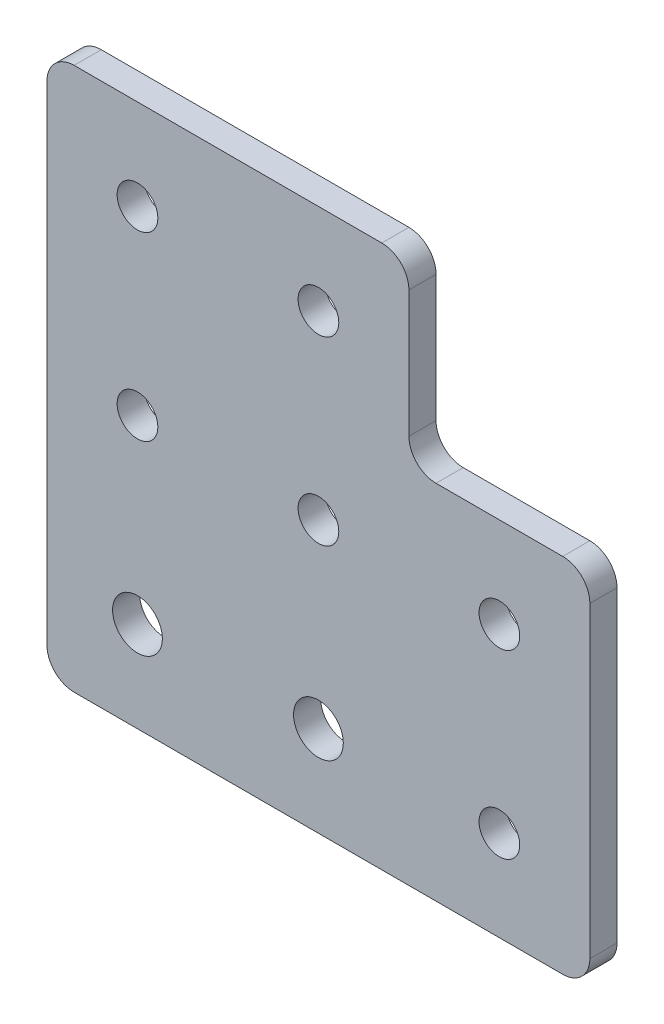
ISO-10303-21;
HEADER;
FILE_DESCRIPTION(('STEP AP214'),'2;1');
FILE_NAME('part.step','',(''),(''),'','','');
FILE_SCHEMA(('AUTOMOTIVE_DESIGN { 1 0 10303 214 1 1 1 1 }'));
ENDSEC;
DATA;
#1=APPLICATION_CONTEXT('core data for automotive mechanical design processes');
#2=APPLICATION_PROTOCOL_DEFINITION('international standard','automotive_design',2000,#1);
#3=PRODUCT_CONTEXT('',#1,'mechanical');
#4=PRODUCT('Part','Part','',(#3));
#5=PRODUCT_RELATED_PRODUCT_CATEGORY('part','',(#4));
#6=PRODUCT_DEFINITION_FORMATION('','',#4);
#7=PRODUCT_DEFINITION_CONTEXT('part definition',#1,'design');
#8=PRODUCT_DEFINITION('design','',#6,#7);
#9=PRODUCT_DEFINITION_SHAPE('','',#8);
#10=(LENGTH_UNIT() NAMED_UNIT(*) SI_UNIT(.MILLI.,.METRE.));
#11=(NAMED_UNIT(*) PLANE_ANGLE_UNIT() SI_UNIT($,.RADIAN.));
#12=(NAMED_UNIT(*) SI_UNIT($,.STERADIAN.) SOLID_ANGLE_UNIT());
#13=UNCERTAINTY_MEASURE_WITH_UNIT(LENGTH_MEASURE(1.E-05),#10,'distance_accuracy_value','');
#14=(GEOMETRIC_REPRESENTATION_CONTEXT(3) GLOBAL_UNCERTAINTY_ASSIGNED_CONTEXT((#13)) GLOBAL_UNIT_ASSIGNED_CONTEXT((#10,
#11,#12)) REPRESENTATION_CONTEXT('',''));
#15=CARTESIAN_POINT('',(0.,0.,0.));
#16=DIRECTION('',(0.,0.,1.));
#17=DIRECTION('',(1.,0.,0.));
#18=AXIS2_PLACEMENT_3D('',#15,#16,#17);
#19=CARTESIAN_POINT('',(0.,-9.61116559346406,3.));
#20=DIRECTION('',(0.,1.,0.));
#21=DIRECTION('',(0.,0.,1.));
#22=AXIS2_PLACEMENT_3D('',#19,#20,#21);
#23=PLANE('',#22);
#24=DIRECTION('',(1.,0.,0.));
#25=VECTOR('',#24,1.);
#26=CARTESIAN_POINT('',(0.,-9.61116559346406,0.));
#27=LINE('',#26,#25);
#28=CARTESIAN_POINT('',(-28.6285979916155,-9.61116559346406,0.));
#29=VERTEX_POINT('',#28);
#30=CARTESIAN_POINT('',(25.3714020083845,-9.61116559346406,0.));
#31=VERTEX_POINT('',#30);
#32=EDGE_CURVE('E146',#29,#31,#27,.T.);
#33=ORIENTED_EDGE('',*,*,#32,.T.);
#34=DIRECTION('',(0.,0.,-1.));
#35=VECTOR('',#34,1.);
#36=CARTESIAN_POINT('',(25.3714020083845,-9.61116559346406,3.));
#37=LINE('',#36,#35);
#38=CARTESIAN_POINT('',(25.3714020083845,-9.61116559346406,3.));
#39=VERTEX_POINT('',#38);
#40=EDGE_CURVE('E125',#31,#39,#37,.F.);
#41=ORIENTED_EDGE('',*,*,#40,.T.);
#42=DIRECTION('',(1.,0.,0.));
#43=VECTOR('',#42,1.);
#44=CARTESIAN_POINT('',(0.,-9.61116559346406,3.));
#45=LINE('',#44,#43);
#46=CARTESIAN_POINT('',(-28.6285979916155,-9.61116559346406,3.));
#47=VERTEX_POINT('',#46);
#48=EDGE_CURVE('E327',#47,#39,#45,.T.);
#49=ORIENTED_EDGE('',*,*,#48,.F.);
#50=DIRECTION('',(0.,0.,-1.));
#51=VECTOR('',#50,1.);
#52=CARTESIAN_POINT('',(-28.6285979916155,-9.61116559346406,3.));
#53=LINE('',#52,#51);
#54=EDGE_CURVE('E129',#47,#29,#53,.T.);
#55=ORIENTED_EDGE('',*,*,#54,.T.);
#56=EDGE_LOOP('',(#33,#41,#49,#55));
#57=FACE_BOUND('',#56,.T.);
#58=ADVANCED_FACE('F33',(#57),#23,.F.);
#59=CARTESIAN_POINT('',(28.3714020083845,0.,3.));
#60=DIRECTION('',(-1.,0.,0.));
#61=DIRECTION('',(0.,0.,1.));
#62=AXIS2_PLACEMENT_3D('',#59,#60,#61);
#63=PLANE('',#62);
#64=DIRECTION('',(0.,1.,0.));
#65=VECTOR('',#64,1.);
#66=CARTESIAN_POINT('',(28.3714020083845,0.,3.));
#67=LINE('',#66,#65);
#68=CARTESIAN_POINT('',(28.3714020083845,-6.61116559346406,3.));
#69=VERTEX_POINT('',#68);
#70=CARTESIAN_POINT('',(28.3714020083845,27.3888344065359,3.));
#71=VERTEX_POINT('',#70);
#72=EDGE_CURVE('E139',#69,#71,#67,.T.);
#73=ORIENTED_EDGE('',*,*,#72,.F.);
#74=DIRECTION('',(0.,0.,-1.));
#75=VECTOR('',#74,1.);
#76=CARTESIAN_POINT('',(28.3714020083845,-6.61116559346406,3.));
#77=LINE('',#76,#75);
#78=CARTESIAN_POINT('',(28.3714020083845,-6.61116559346406,0.));
#79=VERTEX_POINT('',#78);
#80=EDGE_CURVE('E124',#69,#79,#77,.T.);
#81=ORIENTED_EDGE('',*,*,#80,.T.);
#82=DIRECTION('',(0.,1.,0.));
#83=VECTOR('',#82,1.);
#84=CARTESIAN_POINT('',(28.3714020083845,0.,0.));
#85=LINE('',#84,#83);
#86=CARTESIAN_POINT('',(28.3714020083845,27.3888344065359,0.));
#87=VERTEX_POINT('',#86);
#88=EDGE_CURVE('E136',#79,#87,#85,.T.);
#89=ORIENTED_EDGE('',*,*,#88,.T.);
#90=DIRECTION('',(0.,0.,-1.));
#91=VECTOR('',#90,1.);
#92=CARTESIAN_POINT('',(28.3714020083845,27.3888344065359,3.));
#93=LINE('',#92,#91);
#94=EDGE_CURVE('E141',#87,#71,#93,.F.);
#95=ORIENTED_EDGE('',*,*,#94,.T.);
#96=EDGE_LOOP('',(#73,#81,#89,#95));
#97=FACE_BOUND('',#96,.T.);
#98=ADVANCED_FACE('F135',(#97),#63,.F.);
#99=CARTESIAN_POINT('',(0.,30.3888344065359,3.));
#100=DIRECTION('',(0.,1.,0.));
#101=DIRECTION('',(0.,0.,1.));
#102=AXIS2_PLACEMENT_3D('',#99,#100,#101);
#103=PLANE('',#102);
#104=DIRECTION('',(1.,0.,0.));
#105=VECTOR('',#104,1.);
#106=CARTESIAN_POINT('',(0.,30.3888344065359,0.));
#107=LINE('',#106,#105);
#108=CARTESIAN_POINT('',(11.3714020083845,30.3888344065359,0.));
#109=VERTEX_POINT('',#108);
#110=CARTESIAN_POINT('',(25.3714020083845,30.3888344065359,0.));
#111=VERTEX_POINT('',#110);
#112=EDGE_CURVE('E145',#109,#111,#107,.T.);
#113=ORIENTED_EDGE('',*,*,#112,.F.);
#114=DIRECTION('',(0.,0.,-1.));
#115=VECTOR('',#114,1.);
#116=CARTESIAN_POINT('',(11.3714020083845,30.3888344065359,3.));
#117=LINE('',#116,#115);
#118=CARTESIAN_POINT('',(11.3714020083845,30.3888344065359,3.));
#119=VERTEX_POINT('',#118);
#120=EDGE_CURVE('E54',#109,#119,#117,.F.);
#121=ORIENTED_EDGE('',*,*,#120,.T.);
#122=DIRECTION('',(1.,0.,0.));
#123=VECTOR('',#122,1.);
#124=CARTESIAN_POINT('',(0.,30.3888344065359,3.));
#125=LINE('',#124,#123);
#126=CARTESIAN_POINT('',(25.3714020083845,30.3888344065359,3.));
#127=VERTEX_POINT('',#126);
#128=EDGE_CURVE('E228',#119,#127,#125,.T.);
#129=ORIENTED_EDGE('',*,*,#128,.T.);
#130=DIRECTION('',(0.,0.,-1.));
#131=VECTOR('',#130,1.);
#132=CARTESIAN_POINT('',(25.3714020083845,30.3888344065359,0.));
#133=LINE('',#132,#131);
#134=EDGE_CURVE('E184',#127,#111,#133,.T.);
#135=ORIENTED_EDGE('',*,*,#134,.T.);
#136=EDGE_LOOP('',(#113,#121,#129,#135));
#137=FACE_BOUND('',#136,.T.);
#138=ADVANCED_FACE('F276',(#137),#103,.T.);
#139=CARTESIAN_POINT('',(8.3714020083845,0.,3.));
#140=DIRECTION('',(1.,0.,0.));
#141=DIRECTION('',(0.,1.,0.));
#142=AXIS2_PLACEMENT_3D('',#139,#140,#141);
#143=PLANE('',#142);
#144=DIRECTION('',(0.,-1.,0.));
#145=VECTOR('',#144,1.);
#146=CARTESIAN_POINT('',(8.3714020083845,0.,3.));
#147=LINE('',#146,#145);
#148=CARTESIAN_POINT('',(8.3714020083845,47.3888344065359,3.));
#149=VERTEX_POINT('',#148);
#150=CARTESIAN_POINT('',(8.3714020083845,33.3888344065359,3.));
#151=VERTEX_POINT('',#150);
#152=EDGE_CURVE('E209',#149,#151,#147,.T.);
#153=ORIENTED_EDGE('',*,*,#152,.T.);
#154=DIRECTION('',(0.,0.,-1.));
#155=VECTOR('',#154,1.);
#156=CARTESIAN_POINT('',(8.3714020083845,33.3888344065359,0.));
#157=LINE('',#156,#155);
#158=CARTESIAN_POINT('',(8.3714020083845,33.3888344065359,0.));
#159=VERTEX_POINT('',#158);
#160=EDGE_CURVE('E199',#151,#159,#157,.T.);
#161=ORIENTED_EDGE('',*,*,#160,.T.);
#162=DIRECTION('',(0.,-1.,0.));
#163=VECTOR('',#162,1.);
#164=CARTESIAN_POINT('',(8.3714020083845,0.,0.));
#165=LINE('',#164,#163);
#166=CARTESIAN_POINT('',(8.3714020083845,47.3888344065359,0.));
#167=VERTEX_POINT('',#166);
#168=EDGE_CURVE('E148',#167,#159,#165,.T.);
#169=ORIENTED_EDGE('',*,*,#168,.F.);
#170=DIRECTION('',(0.,0.,-1.));
#171=VECTOR('',#170,1.);
#172=CARTESIAN_POINT('',(8.3714020083845,47.3888344065359,3.));
#173=LINE('',#172,#171);
#174=EDGE_CURVE('E192',#167,#149,#173,.F.);
#175=ORIENTED_EDGE('',*,*,#174,.T.);
#176=EDGE_LOOP('',(#153,#161,#169,#175));
#177=FACE_BOUND('',#176,.T.);
#178=ADVANCED_FACE('F206',(#177),#143,.T.);
#179=CARTESIAN_POINT('',(0.,50.3888344065359,3.));
#180=DIRECTION('',(0.,1.,0.));
#181=DIRECTION('',(0.,0.,1.));
#182=AXIS2_PLACEMENT_3D('',#179,#180,#181);
#183=PLANE('',#182);
#184=DIRECTION('',(1.,0.,0.));
#185=VECTOR('',#184,1.);
#186=CARTESIAN_POINT('',(0.,50.3888344065359,3.));
#187=LINE('',#186,#185);
#188=CARTESIAN_POINT('',(-28.6285979916155,50.3888344065359,3.));
#189=VERTEX_POINT('',#188);
#190=CARTESIAN_POINT('',(5.3714020083845,50.3888344065359,3.));
#191=VERTEX_POINT('',#190);
#192=EDGE_CURVE('E222',#189,#191,#187,.T.);
#193=ORIENTED_EDGE('',*,*,#192,.T.);
#194=DIRECTION('',(0.,0.,-1.));
#195=VECTOR('',#194,1.);
#196=CARTESIAN_POINT('',(5.3714020083845,50.3888344065359,3.));
#197=LINE('',#196,#195);
#198=CARTESIAN_POINT('',(5.3714020083845,50.3888344065359,0.));
#199=VERTEX_POINT('',#198);
#200=EDGE_CURVE('E189',#191,#199,#197,.T.);
#201=ORIENTED_EDGE('',*,*,#200,.T.);
#202=DIRECTION('',(1.,0.,0.));
#203=VECTOR('',#202,1.);
#204=CARTESIAN_POINT('',(0.,50.3888344065359,0.));
#205=LINE('',#204,#203);
#206=CARTESIAN_POINT('',(-28.6285979916155,50.3888344065359,0.));
#207=VERTEX_POINT('',#206);
#208=EDGE_CURVE('E155',#207,#199,#205,.T.);
#209=ORIENTED_EDGE('',*,*,#208,.F.);
#210=DIRECTION('',(0.,0.,-1.));
#211=VECTOR('',#210,1.);
#212=CARTESIAN_POINT('',(-28.6285979916155,50.3888344065359,3.));
#213=LINE('',#212,#211);
#214=EDGE_CURVE('E187',#207,#189,#213,.F.);
#215=ORIENTED_EDGE('',*,*,#214,.T.);
#216=EDGE_LOOP('',(#193,#201,#209,#215));
#217=FACE_BOUND('',#216,.T.);
#218=ADVANCED_FACE('F219',(#217),#183,.T.);
#219=CARTESIAN_POINT('',(-21.6285979916155,40.3888344065359,3.));
#220=DIRECTION('',(0.,0.,-1.));
#221=DIRECTION('',(-1.,0.,0.));
#222=AXIS2_PLACEMENT_3D('',#219,#220,#221);
#223=CYLINDRICAL_SURFACE('',#222,2.25);
#224=CARTESIAN_POINT('',(-21.6285979916155,40.3888344065359,3.));
#225=DIRECTION('',(0.,0.,1.));
#226=DIRECTION('',(1.,0.,0.));
#227=AXIS2_PLACEMENT_3D('',#224,#225,#226);
#228=CIRCLE('',#227,2.25);
#229=CARTESIAN_POINT('',(-19.3785979916155,40.3888344065359,3.));
#230=VERTEX_POINT('',#229);
#231=EDGE_CURVE('E324',#230,#230,#228,.T.);
#232=ORIENTED_EDGE('',*,*,#231,.T.);
#233=EDGE_LOOP('',(#232));
#234=FACE_BOUND('',#233,.T.);
#235=CARTESIAN_POINT('',(-21.6285979916155,40.3888344065359,0.));
#236=DIRECTION('',(0.,0.,1.));
#237=DIRECTION('',(1.,0.,0.));
#238=AXIS2_PLACEMENT_3D('',#235,#236,#237);
#239=CIRCLE('',#238,2.25);
#240=CARTESIAN_POINT('',(-19.3785979916155,40.3888344065359,0.));
#241=VERTEX_POINT('',#240);
#242=EDGE_CURVE('E150',#241,#241,#239,.T.);
#243=ORIENTED_EDGE('',*,*,#242,.F.);
#244=EDGE_LOOP('',(#243));
#245=FACE_BOUND('',#244,.T.);
#246=ADVANCED_FACE('F256',(#234,#245),#223,.F.);
#247=CARTESIAN_POINT('',(-1.6285979916155,40.3888344065359,3.));
#248=DIRECTION('',(0.,0.,-1.));
#249=DIRECTION('',(-1.,0.,0.));
#250=AXIS2_PLACEMENT_3D('',#247,#248,#249);
#251=CYLINDRICAL_SURFACE('',#250,2.25);
#252=CARTESIAN_POINT('',(-1.6285979916155,40.3888344065359,3.));
#253=DIRECTION('',(0.,0.,1.));
#254=DIRECTION('',(1.,0.,0.));
#255=AXIS2_PLACEMENT_3D('',#252,#253,#254);
#256=CIRCLE('',#255,2.25);
#257=CARTESIAN_POINT('',(0.621402008384497,40.3888344065359,3.));
#258=VERTEX_POINT('',#257);
#259=EDGE_CURVE('E322',#258,#258,#256,.T.);
#260=ORIENTED_EDGE('',*,*,#259,.T.);
#261=EDGE_LOOP('',(#260));
#262=FACE_BOUND('',#261,.T.);
#263=CARTESIAN_POINT('',(-1.6285979916155,40.3888344065359,0.));
#264=DIRECTION('',(0.,0.,1.));
#265=DIRECTION('',(1.,0.,0.));
#266=AXIS2_PLACEMENT_3D('',#263,#264,#265);
#267=CIRCLE('',#266,2.25);
#268=CARTESIAN_POINT('',(0.621402008384497,40.3888344065359,0.));
#269=VERTEX_POINT('',#268);
#270=EDGE_CURVE('E250',#269,#269,#267,.T.);
#271=ORIENTED_EDGE('',*,*,#270,.F.);
#272=EDGE_LOOP('',(#271));
#273=FACE_BOUND('',#272,.T.);
#274=ADVANCED_FACE('F258',(#262,#273),#251,.F.);
#275=CARTESIAN_POINT('',(-21.6285979916155,20.3888344065359,3.));
#276=DIRECTION('',(0.,0.,-1.));
#277=DIRECTION('',(-1.,0.,0.));
#278=AXIS2_PLACEMENT_3D('',#275,#276,#277);
#279=CYLINDRICAL_SURFACE('',#278,2.25);
#280=CARTESIAN_POINT('',(-21.6285979916155,20.3888344065359,3.));
#281=DIRECTION('',(0.,0.,1.));
#282=DIRECTION('',(1.,0.,0.));
#283=AXIS2_PLACEMENT_3D('',#280,#281,#282);
#284=CIRCLE('',#283,2.25);
#285=CARTESIAN_POINT('',(-19.3785979916155,20.3888344065359,3.));
#286=VERTEX_POINT('',#285);
#287=EDGE_CURVE('E318',#286,#286,#284,.T.);
#288=ORIENTED_EDGE('',*,*,#287,.T.);
#289=EDGE_LOOP('',(#288));
#290=FACE_BOUND('',#289,.T.);
#291=CARTESIAN_POINT('',(-21.6285979916155,20.3888344065359,0.));
#292=DIRECTION('',(0.,0.,1.));
#293=DIRECTION('',(1.,0.,0.));
#294=AXIS2_PLACEMENT_3D('',#291,#292,#293);
#295=CIRCLE('',#294,2.25);
#296=CARTESIAN_POINT('',(-19.3785979916155,20.3888344065359,0.));
#297=VERTEX_POINT('',#296);
#298=EDGE_CURVE('E247',#297,#297,#295,.T.);
#299=ORIENTED_EDGE('',*,*,#298,.F.);
#300=EDGE_LOOP('',(#299));
#301=FACE_BOUND('',#300,.T.);
#302=ADVANCED_FACE('F265',(#290,#301),#279,.F.);
#303=CARTESIAN_POINT('',(-21.6285979916155,0.38883440653594,3.));
#304=DIRECTION('',(0.,0.,-1.));
#305=DIRECTION('',(-1.,0.,0.));
#306=AXIS2_PLACEMENT_3D('',#303,#304,#305);
#307=CYLINDRICAL_SURFACE('',#306,2.75);
#308=CARTESIAN_POINT('',(-21.6285979916155,0.38883440653594,3.));
#309=DIRECTION('',(0.,0.,1.));
#310=DIRECTION('',(1.,0.,0.));
#311=AXIS2_PLACEMENT_3D('',#308,#309,#310);
#312=CIRCLE('',#311,2.75);
#313=CARTESIAN_POINT('',(-18.8785979916155,0.38883440653594,3.));
#314=VERTEX_POINT('',#313);
#315=EDGE_CURVE('E314',#314,#314,#312,.T.);
#316=ORIENTED_EDGE('',*,*,#315,.T.);
#317=EDGE_LOOP('',(#316));
#318=FACE_BOUND('',#317,.T.);
#319=CARTESIAN_POINT('',(-21.6285979916155,0.38883440653594,0.));
#320=DIRECTION('',(0.,0.,1.));
#321=DIRECTION('',(1.,0.,0.));
#322=AXIS2_PLACEMENT_3D('',#319,#320,#321);
#323=CIRCLE('',#322,2.75);
#324=CARTESIAN_POINT('',(-18.8785979916155,0.38883440653594,0.));
#325=VERTEX_POINT('',#324);
#326=EDGE_CURVE('E244',#325,#325,#323,.T.);
#327=ORIENTED_EDGE('',*,*,#326,.F.);
#328=EDGE_LOOP('',(#327));
#329=FACE_BOUND('',#328,.T.);
#330=ADVANCED_FACE('F474',(#318,#329),#307,.F.);
#331=CARTESIAN_POINT('',(-1.6285979916155,20.3888344065359,3.));
#332=DIRECTION('',(0.,0.,-1.));
#333=DIRECTION('',(-1.,0.,0.));
#334=AXIS2_PLACEMENT_3D('',#331,#332,#333);
#335=CYLINDRICAL_SURFACE('',#334,2.25);
#336=CARTESIAN_POINT('',(-1.6285979916155,20.3888344065359,3.));
#337=DIRECTION('',(0.,0.,1.));
#338=DIRECTION('',(1.,0.,0.));
#339=AXIS2_PLACEMENT_3D('',#336,#337,#338);
#340=CIRCLE('',#339,2.25);
#341=CARTESIAN_POINT('',(0.621402008384502,20.3888344065359,3.));
#342=VERTEX_POINT('',#341);
#343=EDGE_CURVE('E310',#342,#342,#340,.T.);
#344=ORIENTED_EDGE('',*,*,#343,.T.);
#345=EDGE_LOOP('',(#344));
#346=FACE_BOUND('',#345,.T.);
#347=CARTESIAN_POINT('',(-1.6285979916155,20.3888344065359,0.));
#348=DIRECTION('',(0.,0.,1.));
#349=DIRECTION('',(1.,0.,0.));
#350=AXIS2_PLACEMENT_3D('',#347,#348,#349);
#351=CIRCLE('',#350,2.25);
#352=CARTESIAN_POINT('',(0.621402008384502,20.3888344065359,0.));
#353=VERTEX_POINT('',#352);
#354=EDGE_CURVE('E241',#353,#353,#351,.T.);
#355=ORIENTED_EDGE('',*,*,#354,.F.);
#356=EDGE_LOOP('',(#355));
#357=FACE_BOUND('',#356,.T.);
#358=ADVANCED_FACE('F464',(#346,#357),#335,.F.);
#359=CARTESIAN_POINT('',(-1.6285979916155,0.388834406535936,3.));
#360=DIRECTION('',(0.,0.,-1.));
#361=DIRECTION('',(-1.,0.,0.));
#362=AXIS2_PLACEMENT_3D('',#359,#360,#361);
#363=CYLINDRICAL_SURFACE('',#362,2.75);
#364=CARTESIAN_POINT('',(-1.6285979916155,0.388834406535936,3.));
#365=DIRECTION('',(0.,0.,1.));
#366=DIRECTION('',(1.,0.,0.));
#367=AXIS2_PLACEMENT_3D('',#364,#365,#366);
#368=CIRCLE('',#367,2.75);
#369=CARTESIAN_POINT('',(1.1214020083845,0.388834406535936,3.));
#370=VERTEX_POINT('',#369);
#371=EDGE_CURVE('E306',#370,#370,#368,.T.);
#372=ORIENTED_EDGE('',*,*,#371,.T.);
#373=EDGE_LOOP('',(#372));
#374=FACE_BOUND('',#373,.T.);
#375=CARTESIAN_POINT('',(-1.6285979916155,0.388834406535936,0.));
#376=DIRECTION('',(0.,0.,1.));
#377=DIRECTION('',(1.,0.,0.));
#378=AXIS2_PLACEMENT_3D('',#375,#376,#377);
#379=CIRCLE('',#378,2.75);
#380=CARTESIAN_POINT('',(1.1214020083845,0.388834406535936,0.));
#381=VERTEX_POINT('',#380);
#382=EDGE_CURVE('E238',#381,#381,#379,.T.);
#383=ORIENTED_EDGE('',*,*,#382,.F.);
#384=EDGE_LOOP('',(#383));
#385=FACE_BOUND('',#384,.T.);
#386=ADVANCED_FACE('F454',(#374,#385),#363,.F.);
#387=CARTESIAN_POINT('',(18.3714020083845,20.3888344065359,3.));
#388=DIRECTION('',(0.,0.,-1.));
#389=DIRECTION('',(-1.,0.,0.));
#390=AXIS2_PLACEMENT_3D('',#387,#388,#389);
#391=CYLINDRICAL_SURFACE('',#390,2.25);
#392=CARTESIAN_POINT('',(18.3714020083845,20.3888344065359,3.));
#393=DIRECTION('',(0.,0.,1.));
#394=DIRECTION('',(1.,0.,0.));
#395=AXIS2_PLACEMENT_3D('',#392,#393,#394);
#396=CIRCLE('',#395,2.25);
#397=CARTESIAN_POINT('',(20.6214020083845,20.3888344065359,3.));
#398=VERTEX_POINT('',#397);
#399=EDGE_CURVE('E302',#398,#398,#396,.T.);
#400=ORIENTED_EDGE('',*,*,#399,.T.);
#401=EDGE_LOOP('',(#400));
#402=FACE_BOUND('',#401,.T.);
#403=CARTESIAN_POINT('',(18.3714020083845,20.3888344065359,0.));
#404=DIRECTION('',(0.,0.,1.));
#405=DIRECTION('',(1.,0.,0.));
#406=AXIS2_PLACEMENT_3D('',#403,#404,#405);
#407=CIRCLE('',#406,2.25);
#408=CARTESIAN_POINT('',(20.6214020083845,20.3888344065359,0.));
#409=VERTEX_POINT('',#408);
#410=EDGE_CURVE('E235',#409,#409,#407,.T.);
#411=ORIENTED_EDGE('',*,*,#410,.F.);
#412=EDGE_LOOP('',(#411));
#413=FACE_BOUND('',#412,.T.);
#414=ADVANCED_FACE('F445',(#402,#413),#391,.F.);
#415=CARTESIAN_POINT('',(18.3714020083845,0.388834406535936,3.));
#416=DIRECTION('',(0.,0.,-1.));
#417=DIRECTION('',(-1.,0.,0.));
#418=AXIS2_PLACEMENT_3D('',#415,#416,#417);
#419=CYLINDRICAL_SURFACE('',#418,2.25);
#420=CARTESIAN_POINT('',(18.3714020083845,0.388834406535936,3.));
#421=DIRECTION('',(0.,0.,1.));
#422=DIRECTION('',(1.,0.,0.));
#423=AXIS2_PLACEMENT_3D('',#420,#421,#422);
#424=CIRCLE('',#423,2.25);
#425=CARTESIAN_POINT('',(20.6214020083845,0.388834406535936,3.));
#426=VERTEX_POINT('',#425);
#427=EDGE_CURVE('E161',#426,#426,#424,.T.);
#428=ORIENTED_EDGE('',*,*,#427,.T.);
#429=EDGE_LOOP('',(#428));
#430=FACE_BOUND('',#429,.T.);
#431=CARTESIAN_POINT('',(18.3714020083845,0.388834406535936,0.));
#432=DIRECTION('',(0.,0.,1.));
#433=DIRECTION('',(1.,0.,0.));
#434=AXIS2_PLACEMENT_3D('',#431,#432,#433);
#435=CIRCLE('',#434,2.25);
#436=CARTESIAN_POINT('',(20.6214020083845,0.388834406535936,0.));
#437=VERTEX_POINT('',#436);
#438=EDGE_CURVE('E232',#437,#437,#435,.T.);
#439=ORIENTED_EDGE('',*,*,#438,.F.);
#440=EDGE_LOOP('',(#439));
#441=FACE_BOUND('',#440,.T.);
#442=ADVANCED_FACE('F287',(#430,#441),#419,.F.);
#443=CARTESIAN_POINT('',(-31.6285979916155,0.,3.));
#444=DIRECTION('',(1.,0.,0.));
#445=DIRECTION('',(0.,0.,-1.));
#446=AXIS2_PLACEMENT_3D('',#443,#444,#445);
#447=PLANE('',#446);
#448=DIRECTION('',(0.,-1.,0.));
#449=VECTOR('',#448,1.);
#450=CARTESIAN_POINT('',(-31.6285979916155,0.,0.));
#451=LINE('',#450,#449);
#452=CARTESIAN_POINT('',(-31.6285979916155,47.3888344065359,0.));
#453=VERTEX_POINT('',#452);
#454=CARTESIAN_POINT('',(-31.6285979916155,-6.61116559346406,0.));
#455=VERTEX_POINT('',#454);
#456=EDGE_CURVE('E158',#453,#455,#451,.T.);
#457=ORIENTED_EDGE('',*,*,#456,.T.);
#458=DIRECTION('',(0.,0.,-1.));
#459=VECTOR('',#458,1.);
#460=CARTESIAN_POINT('',(-31.6285979916155,-6.61116559346406,3.));
#461=LINE('',#460,#459);
#462=CARTESIAN_POINT('',(-31.6285979916155,-6.61116559346406,3.));
#463=VERTEX_POINT('',#462);
#464=EDGE_CURVE('E197',#455,#463,#461,.F.);
#465=ORIENTED_EDGE('',*,*,#464,.T.);
#466=DIRECTION('',(0.,-1.,0.));
#467=VECTOR('',#466,1.);
#468=CARTESIAN_POINT('',(-31.6285979916155,0.,3.));
#469=LINE('',#468,#467);
#470=CARTESIAN_POINT('',(-31.6285979916155,47.3888344065359,3.));
#471=VERTEX_POINT('',#470);
#472=EDGE_CURVE('E162',#471,#463,#469,.T.);
#473=ORIENTED_EDGE('',*,*,#472,.F.);
#474=DIRECTION('',(0.,0.,-1.));
#475=VECTOR('',#474,1.);
#476=CARTESIAN_POINT('',(-31.6285979916155,47.3888344065359,0.));
#477=LINE('',#476,#475);
#478=EDGE_CURVE('E194',#471,#453,#477,.T.);
#479=ORIENTED_EDGE('',*,*,#478,.T.);
#480=EDGE_LOOP('',(#457,#465,#473,#479));
#481=FACE_BOUND('',#480,.T.);
#482=ADVANCED_FACE('F283',(#481),#447,.F.);
#483=CARTESIAN_POINT('',(0.,0.,3.));
#484=DIRECTION('',(0.,0.,1.));
#485=DIRECTION('',(1.,0.,0.));
#486=AXIS2_PLACEMENT_3D('',#483,#484,#485);
#487=PLANE('',#486);
#488=ORIENTED_EDGE('',*,*,#427,.F.);
#489=EDGE_LOOP('',(#488));
#490=FACE_BOUND('',#489,.T.);
#491=ORIENTED_EDGE('',*,*,#399,.F.);
#492=EDGE_LOOP('',(#491));
#493=FACE_BOUND('',#492,.T.);
#494=ORIENTED_EDGE('',*,*,#371,.F.);
#495=EDGE_LOOP('',(#494));
#496=FACE_BOUND('',#495,.T.);
#497=ORIENTED_EDGE('',*,*,#343,.F.);
#498=EDGE_LOOP('',(#497));
#499=FACE_BOUND('',#498,.T.);
#500=ORIENTED_EDGE('',*,*,#315,.F.);
#501=EDGE_LOOP('',(#500));
#502=FACE_BOUND('',#501,.T.);
#503=ORIENTED_EDGE('',*,*,#287,.F.);
#504=EDGE_LOOP('',(#503));
#505=FACE_BOUND('',#504,.T.);
#506=ORIENTED_EDGE('',*,*,#259,.F.);
#507=EDGE_LOOP('',(#506));
#508=FACE_BOUND('',#507,.T.);
#509=ORIENTED_EDGE('',*,*,#231,.F.);
#510=EDGE_LOOP('',(#509));
#511=FACE_BOUND('',#510,.T.);
#512=ORIENTED_EDGE('',*,*,#48,.T.);
#513=CARTESIAN_POINT('',(25.3714020083845,-6.61116559346406,3.));
#514=DIRECTION('',(0.,0.,1.));
#515=DIRECTION('',(1.,0.,0.));
#516=AXIS2_PLACEMENT_3D('',#513,#514,#515);
#517=CIRCLE('',#516,3.);
#518=EDGE_CURVE('E182',#39,#69,#517,.T.);
#519=ORIENTED_EDGE('',*,*,#518,.T.);
#520=ORIENTED_EDGE('',*,*,#72,.T.);
#521=CARTESIAN_POINT('',(25.3714020083845,27.3888344065359,3.));
#522=DIRECTION('',(0.,0.,1.));
#523=DIRECTION('',(1.,0.,0.));
#524=AXIS2_PLACEMENT_3D('',#521,#522,#523);
#525=CIRCLE('',#524,3.);
#526=EDGE_CURVE('E179',#71,#127,#525,.T.);
#527=ORIENTED_EDGE('',*,*,#526,.T.);
#528=ORIENTED_EDGE('',*,*,#128,.F.);
#529=CARTESIAN_POINT('',(11.3714020083845,33.3888344065359,3.));
#530=DIRECTION('',(0.,0.,1.));
#531=DIRECTION('',(1.,0.,0.));
#532=AXIS2_PLACEMENT_3D('',#529,#530,#531);
#533=CIRCLE('',#532,3.);
#534=EDGE_CURVE('E11',#119,#151,#533,.F.);
#535=ORIENTED_EDGE('',*,*,#534,.T.);
#536=ORIENTED_EDGE('',*,*,#152,.F.);
#537=CARTESIAN_POINT('',(5.3714020083845,47.3888344065359,3.));
#538=DIRECTION('',(0.,0.,1.));
#539=DIRECTION('',(1.,0.,0.));
#540=AXIS2_PLACEMENT_3D('',#537,#538,#539);
#541=CIRCLE('',#540,3.);
#542=EDGE_CURVE('E177',#149,#191,#541,.T.);
#543=ORIENTED_EDGE('',*,*,#542,.T.);
#544=ORIENTED_EDGE('',*,*,#192,.F.);
#545=CARTESIAN_POINT('',(-28.6285979916155,47.3888344065359,3.));
#546=DIRECTION('',(0.,0.,1.));
#547=DIRECTION('',(1.,0.,0.));
#548=AXIS2_PLACEMENT_3D('',#545,#546,#547);
#549=CIRCLE('',#548,3.);
#550=EDGE_CURVE('E173',#189,#471,#549,.T.);
#551=ORIENTED_EDGE('',*,*,#550,.T.);
#552=ORIENTED_EDGE('',*,*,#472,.T.);
#553=CARTESIAN_POINT('',(-28.6285979916155,-6.61116559346406,3.));
#554=DIRECTION('',(0.,0.,1.));
#555=DIRECTION('',(1.,0.,0.));
#556=AXIS2_PLACEMENT_3D('',#553,#554,#555);
#557=CIRCLE('',#556,3.);
#558=EDGE_CURVE('E175',#463,#47,#557,.T.);
#559=ORIENTED_EDGE('',*,*,#558,.T.);
#560=EDGE_LOOP('',(#512,#519,#520,#527,#528,#535,#536,#543,#544,#551,#552,#559));
#561=FACE_BOUND('',#560,.T.);
#562=ADVANCED_FACE('F286',(#490,#493,#496,#499,#502,#505,#508,#511,#561),#487,.T.);
#563=CARTESIAN_POINT('',(0.,0.,0.));
#564=DIRECTION('',(0.,0.,1.));
#565=DIRECTION('',(1.,0.,0.));
#566=AXIS2_PLACEMENT_3D('',#563,#564,#565);
#567=PLANE('',#566);
#568=ORIENTED_EDGE('',*,*,#438,.T.);
#569=EDGE_LOOP('',(#568));
#570=FACE_BOUND('',#569,.T.);
#571=ORIENTED_EDGE('',*,*,#410,.T.);
#572=EDGE_LOOP('',(#571));
#573=FACE_BOUND('',#572,.T.);
#574=ORIENTED_EDGE('',*,*,#382,.T.);
#575=EDGE_LOOP('',(#574));
#576=FACE_BOUND('',#575,.T.);
#577=ORIENTED_EDGE('',*,*,#354,.T.);
#578=EDGE_LOOP('',(#577));
#579=FACE_BOUND('',#578,.T.);
#580=ORIENTED_EDGE('',*,*,#326,.T.);
#581=EDGE_LOOP('',(#580));
#582=FACE_BOUND('',#581,.T.);
#583=ORIENTED_EDGE('',*,*,#298,.T.);
#584=EDGE_LOOP('',(#583));
#585=FACE_BOUND('',#584,.T.);
#586=ORIENTED_EDGE('',*,*,#270,.T.);
#587=EDGE_LOOP('',(#586));
#588=FACE_BOUND('',#587,.T.);
#589=ORIENTED_EDGE('',*,*,#242,.T.);
#590=EDGE_LOOP('',(#589));
#591=FACE_BOUND('',#590,.T.);
#592=ORIENTED_EDGE('',*,*,#88,.F.);
#593=CARTESIAN_POINT('',(25.3714020083845,-6.61116559346406,0.));
#594=DIRECTION('',(0.,0.,1.));
#595=DIRECTION('',(1.,0.,0.));
#596=AXIS2_PLACEMENT_3D('',#593,#594,#595);
#597=CIRCLE('',#596,3.);
#598=EDGE_CURVE('E120',#79,#31,#597,.F.);
#599=ORIENTED_EDGE('',*,*,#598,.T.);
#600=ORIENTED_EDGE('',*,*,#32,.F.);
#601=CARTESIAN_POINT('',(-28.6285979916155,-6.61116559346406,0.));
#602=DIRECTION('',(0.,0.,1.));
#603=DIRECTION('',(1.,0.,0.));
#604=AXIS2_PLACEMENT_3D('',#601,#602,#603);
#605=CIRCLE('',#604,3.);
#606=EDGE_CURVE('E165',#29,#455,#605,.F.);
#607=ORIENTED_EDGE('',*,*,#606,.T.);
#608=ORIENTED_EDGE('',*,*,#456,.F.);
#609=CARTESIAN_POINT('',(-28.6285979916155,47.3888344065359,0.));
#610=DIRECTION('',(0.,0.,1.));
#611=DIRECTION('',(1.,0.,0.));
#612=AXIS2_PLACEMENT_3D('',#609,#610,#611);
#613=CIRCLE('',#612,3.);
#614=EDGE_CURVE('E140',#453,#207,#613,.F.);
#615=ORIENTED_EDGE('',*,*,#614,.T.);
#616=ORIENTED_EDGE('',*,*,#208,.T.);
#617=CARTESIAN_POINT('',(5.3714020083845,47.3888344065359,0.));
#618=DIRECTION('',(0.,0.,1.));
#619=DIRECTION('',(1.,0.,0.));
#620=AXIS2_PLACEMENT_3D('',#617,#618,#619);
#621=CIRCLE('',#620,3.);
#622=EDGE_CURVE('E167',#199,#167,#621,.F.);
#623=ORIENTED_EDGE('',*,*,#622,.T.);
#624=ORIENTED_EDGE('',*,*,#168,.T.);
#625=CARTESIAN_POINT('',(11.3714020083845,33.3888344065359,0.));
#626=DIRECTION('',(0.,0.,1.));
#627=DIRECTION('',(1.,0.,0.));
#628=AXIS2_PLACEMENT_3D('',#625,#626,#627);
#629=CIRCLE('',#628,3.);
#630=EDGE_CURVE('E41',#159,#109,#629,.T.);
#631=ORIENTED_EDGE('',*,*,#630,.T.);
#632=ORIENTED_EDGE('',*,*,#112,.T.);
#633=CARTESIAN_POINT('',(25.3714020083845,27.3888344065359,0.));
#634=DIRECTION('',(0.,0.,1.));
#635=DIRECTION('',(1.,0.,0.));
#636=AXIS2_PLACEMENT_3D('',#633,#634,#635);
#637=CIRCLE('',#636,3.);
#638=EDGE_CURVE('E130',#111,#87,#637,.F.);
#639=ORIENTED_EDGE('',*,*,#638,.T.);
#640=EDGE_LOOP('',(#592,#599,#600,#607,#608,#615,#616,#623,#624,#631,#632,#639));
#641=FACE_BOUND('',#640,.T.);
#642=ADVANCED_FACE('F143',(#570,#573,#576,#579,#582,#585,#588,#591,#641),#567,.F.);
#643=CARTESIAN_POINT('',(25.3714020083845,-6.61116559346406,3.));
#644=DIRECTION('',(0.,0.,-1.));
#645=DIRECTION('',(-1.,0.,0.));
#646=AXIS2_PLACEMENT_3D('',#643,#644,#645);
#647=CYLINDRICAL_SURFACE('',#646,3.);
#648=ORIENTED_EDGE('',*,*,#518,.F.);
#649=ORIENTED_EDGE('',*,*,#40,.F.);
#650=ORIENTED_EDGE('',*,*,#598,.F.);
#651=ORIENTED_EDGE('',*,*,#80,.F.);
#652=EDGE_LOOP('',(#648,#649,#650,#651));
#653=FACE_BOUND('',#652,.T.);
#654=ADVANCED_FACE('F123',(#653),#647,.T.);
#655=CARTESIAN_POINT('',(25.3714020083845,27.3888344065359,3.));
#656=DIRECTION('',(0.,0.,1.));
#657=DIRECTION('',(1.,0.,0.));
#658=AXIS2_PLACEMENT_3D('',#655,#656,#657);
#659=CYLINDRICAL_SURFACE('',#658,3.);
#660=ORIENTED_EDGE('',*,*,#526,.F.);
#661=ORIENTED_EDGE('',*,*,#94,.F.);
#662=ORIENTED_EDGE('',*,*,#638,.F.);
#663=ORIENTED_EDGE('',*,*,#134,.F.);
#664=EDGE_LOOP('',(#660,#661,#662,#663));
#665=FACE_BOUND('',#664,.T.);
#666=ADVANCED_FACE('F337',(#665),#659,.T.);
#667=CARTESIAN_POINT('',(5.3714020083845,47.3888344065359,3.));
#668=DIRECTION('',(0.,0.,-1.));
#669=DIRECTION('',(-1.,0.,0.));
#670=AXIS2_PLACEMENT_3D('',#667,#668,#669);
#671=CYLINDRICAL_SURFACE('',#670,3.);
#672=ORIENTED_EDGE('',*,*,#542,.F.);
#673=ORIENTED_EDGE('',*,*,#174,.F.);
#674=ORIENTED_EDGE('',*,*,#622,.F.);
#675=ORIENTED_EDGE('',*,*,#200,.F.);
#676=EDGE_LOOP('',(#672,#673,#674,#675));
#677=FACE_BOUND('',#676,.T.);
#678=ADVANCED_FACE('F216',(#677),#671,.T.);
#679=CARTESIAN_POINT('',(-28.6285979916155,-6.61116559346406,3.));
#680=DIRECTION('',(0.,0.,-1.));
#681=DIRECTION('',(-1.,0.,0.));
#682=AXIS2_PLACEMENT_3D('',#679,#680,#681);
#683=CYLINDRICAL_SURFACE('',#682,3.);
#684=ORIENTED_EDGE('',*,*,#558,.F.);
#685=ORIENTED_EDGE('',*,*,#464,.F.);
#686=ORIENTED_EDGE('',*,*,#606,.F.);
#687=ORIENTED_EDGE('',*,*,#54,.F.);
#688=EDGE_LOOP('',(#684,#685,#686,#687));
#689=FACE_BOUND('',#688,.T.);
#690=ADVANCED_FACE('F344',(#689),#683,.T.);
#691=CARTESIAN_POINT('',(-28.6285979916155,47.3888344065359,3.));
#692=DIRECTION('',(0.,0.,1.));
#693=DIRECTION('',(1.,0.,0.));
#694=AXIS2_PLACEMENT_3D('',#691,#692,#693);
#695=CYLINDRICAL_SURFACE('',#694,3.);
#696=ORIENTED_EDGE('',*,*,#550,.F.);
#697=ORIENTED_EDGE('',*,*,#214,.F.);
#698=ORIENTED_EDGE('',*,*,#614,.F.);
#699=ORIENTED_EDGE('',*,*,#478,.F.);
#700=EDGE_LOOP('',(#696,#697,#698,#699));
#701=FACE_BOUND('',#700,.T.);
#702=ADVANCED_FACE('F350',(#701),#695,.T.);
#703=CARTESIAN_POINT('',(11.3714020083845,33.3888344065359,3.));
#704=DIRECTION('',(0.,0.,1.));
#705=DIRECTION('',(1.,0.,0.));
#706=AXIS2_PLACEMENT_3D('',#703,#704,#705);
#707=CYLINDRICAL_SURFACE('',#706,3.);
#708=ORIENTED_EDGE('',*,*,#534,.F.);
#709=ORIENTED_EDGE('',*,*,#120,.F.);
#710=ORIENTED_EDGE('',*,*,#630,.F.);
#711=ORIENTED_EDGE('',*,*,#160,.F.);
#712=EDGE_LOOP('',(#708,#709,#710,#711));
#713=FACE_BOUND('',#712,.T.);
#714=ADVANCED_FACE('F35',(#713),#707,.F.);
#715=CLOSED_SHELL('',(#58,#98,#138,#178,#218,#246,#274,#302,#330,#358,#386,#414,#442,#482,#562,
#642,#654,#666,#678,#690,#702,#714));
#716=MANIFOLD_SOLID_BREP('B2',#715);
#717=ADVANCED_BREP_SHAPE_REPRESENTATION('',(#18,#716),#14);
#718=SHAPE_DEFINITION_REPRESENTATION(#9,#717);
ENDSEC;
END-ISO-10303-21;
